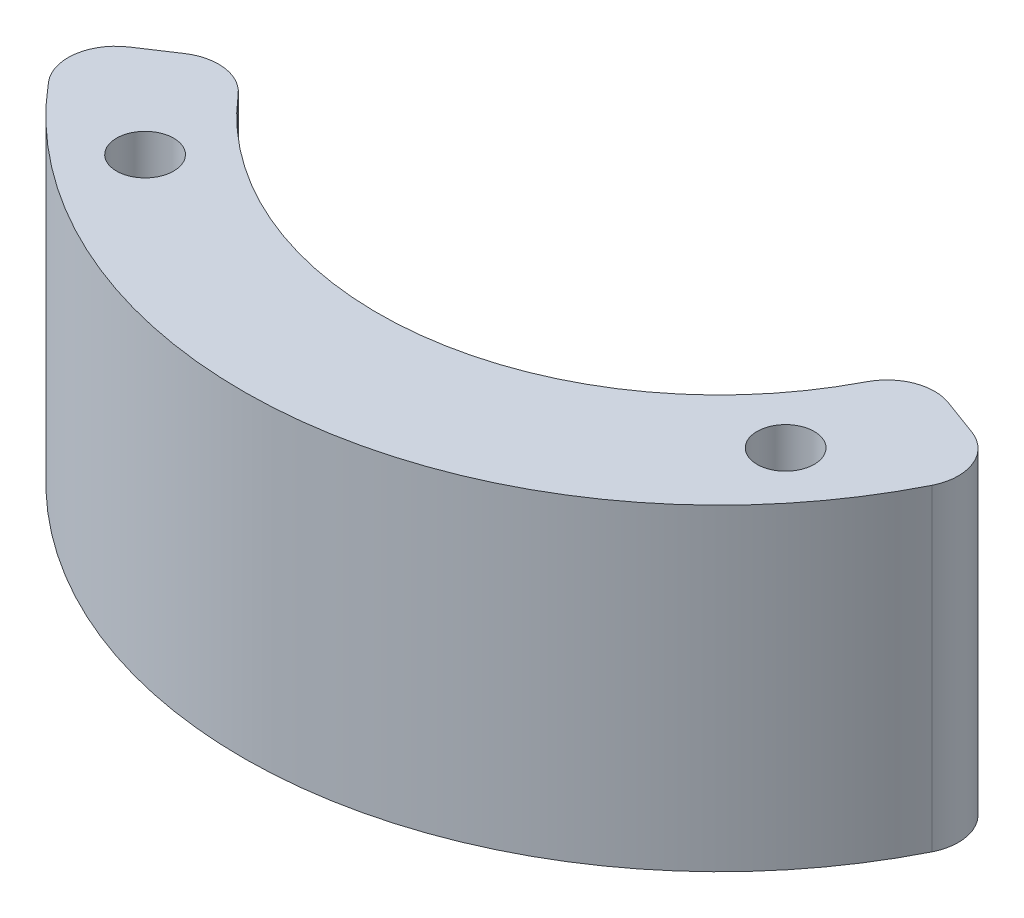
ISO-10303-21;
HEADER;
FILE_DESCRIPTION(('STEP AP214'),'2;1');
FILE_NAME('part.step','',(''),(''),'','','');
FILE_SCHEMA(('AUTOMOTIVE_DESIGN { 1 0 10303 214 1 1 1 1 }'));
ENDSEC;
DATA;
#1=APPLICATION_CONTEXT('core data for automotive mechanical design processes');
#2=APPLICATION_PROTOCOL_DEFINITION('international standard','automotive_design',2000,#1);
#3=PRODUCT_CONTEXT('',#1,'mechanical');
#4=PRODUCT('Part','Part','',(#3));
#5=PRODUCT_RELATED_PRODUCT_CATEGORY('part','',(#4));
#6=PRODUCT_DEFINITION_FORMATION('','',#4);
#7=PRODUCT_DEFINITION_CONTEXT('part definition',#1,'design');
#8=PRODUCT_DEFINITION('design','',#6,#7);
#9=PRODUCT_DEFINITION_SHAPE('','',#8);
#10=(LENGTH_UNIT() NAMED_UNIT(*) SI_UNIT(.MILLI.,.METRE.));
#11=(NAMED_UNIT(*) PLANE_ANGLE_UNIT() SI_UNIT($,.RADIAN.));
#12=(NAMED_UNIT(*) SI_UNIT($,.STERADIAN.) SOLID_ANGLE_UNIT());
#13=UNCERTAINTY_MEASURE_WITH_UNIT(LENGTH_MEASURE(1.E-05),#10,'distance_accuracy_value','');
#14=(GEOMETRIC_REPRESENTATION_CONTEXT(3) GLOBAL_UNCERTAINTY_ASSIGNED_CONTEXT((#13)) GLOBAL_UNIT_ASSIGNED_CONTEXT((#10,
#11,#12)) REPRESENTATION_CONTEXT('',''));
#15=CARTESIAN_POINT('',(0.,0.,0.));
#16=DIRECTION('',(0.,0.,1.));
#17=DIRECTION('',(1.,0.,0.));
#18=AXIS2_PLACEMENT_3D('',#15,#16,#17);
#19=CARTESIAN_POINT('',(0.,20.,0.));
#20=DIRECTION('',(0.,1.,0.));
#21=DIRECTION('',(0.,0.,1.));
#22=AXIS2_PLACEMENT_3D('',#19,#20,#21);
#23=PLANE('',#22);
#24=CARTESIAN_POINT('',(20.1757899473601,20.,16.0000000000001));
#25=DIRECTION('',(0.,1.,0.));
#26=DIRECTION('',(0.,0.,1.));
#27=AXIS2_PLACEMENT_3D('',#24,#25,#26);
#28=CIRCLE('',#27,1.8);
#29=CARTESIAN_POINT('',(20.1757899473601,20.,17.8000000000001));
#30=VERTEX_POINT('',#29);
#31=EDGE_CURVE('E148',#30,#30,#28,.T.);
#32=ORIENTED_EDGE('',*,*,#31,.F.);
#33=EDGE_LOOP('',(#32));
#34=FACE_BOUND('',#33,.T.);
#35=CARTESIAN_POINT('',(0.,20.,0.));
#36=DIRECTION('',(0.,1.,0.));
#37=DIRECTION('',(0.,0.,1.));
#38=AXIS2_PLACEMENT_3D('',#35,#36,#37);
#39=CIRCLE('',#38,30.);
#40=CARTESIAN_POINT('',(-23.023496221672,20.,19.2332686179613));
#41=VERTEX_POINT('',#40);
#42=CARTESIAN_POINT('',(26.8261895052967,20.,13.4296521409122));
#43=VERTEX_POINT('',#42);
#44=EDGE_CURVE('E154',#41,#43,#39,.T.);
#45=ORIENTED_EDGE('',*,*,#44,.T.);
#46=CARTESIAN_POINT('',(24.1435705547671,20.,12.086686926821));
#47=DIRECTION('',(0.,1.,0.));
#48=DIRECTION('',(0.,0.,1.));
#49=AXIS2_PLACEMENT_3D('',#46,#47,#48);
#50=CIRCLE('',#49,3.);
#51=CARTESIAN_POINT('',(25.1801513425418,20.,9.27146042253817));
#52=VERTEX_POINT('',#51);
#53=EDGE_CURVE('E178',#43,#52,#50,.T.);
#54=ORIENTED_EDGE('',*,*,#53,.T.);
#55=DIRECTION('',(-0.938408834760933,0.,-0.345526929258238));
#56=VECTOR('',#55,1.);
#57=CARTESIAN_POINT('',(20.1757899473601,20.,7.42882897905212));
#58=LINE('',#57,#56);
#59=CARTESIAN_POINT('',(22.8180046719536,20.,8.40170594526513));
#60=VERTEX_POINT('',#59);
#61=EDGE_CURVE('E131',#52,#60,#58,.T.);
#62=ORIENTED_EDGE('',*,*,#61,.T.);
#63=CARTESIAN_POINT('',(21.7814238841789,20.,11.2169324495479));
#64=DIRECTION('',(0.,1.,0.));
#65=DIRECTION('',(0.,0.,1.));
#66=AXIS2_PLACEMENT_3D('',#63,#64,#65);
#67=CIRCLE('',#66,3.);
#68=CARTESIAN_POINT('',(19.1143107555039,20.,9.84343051695022));
#69=VERTEX_POINT('',#68);
#70=EDGE_CURVE('E175',#60,#69,#67,.T.);
#71=ORIENTED_EDGE('',*,*,#70,.T.);
#72=CARTESIAN_POINT('',(0.,20.,0.));
#73=DIRECTION('',(0.,-1.,0.));
#74=DIRECTION('',(0.,0.,1.));
#75=AXIS2_PLACEMENT_3D('',#72,#73,#74);
#76=CIRCLE('',#75,21.5);
#77=CARTESIAN_POINT('',(-16.3417435760468,20.,13.9713069143417));
#78=VERTEX_POINT('',#77);
#79=EDGE_CURVE('E190',#69,#78,#76,.T.);
#80=ORIENTED_EDGE('',*,*,#79,.T.);
#81=CARTESIAN_POINT('',(-18.6219868657278,20.,15.9207916000638));
#82=DIRECTION('',(0.,1.,0.));
#83=DIRECTION('',(0.,0.,1.));
#84=AXIS2_PLACEMENT_3D('',#81,#82,#83);
#85=CIRCLE('',#84,3.);
#86=CARTESIAN_POINT('',(-20.277587843677,20.,13.4189951651368));
#87=VERTEX_POINT('',#86);
#88=EDGE_CURVE('E65',#78,#87,#85,.T.);
#89=ORIENTED_EDGE('',*,*,#88,.T.);
#90=DIRECTION('',(-0.833932144975681,0.,0.551866992649732));
#91=VECTOR('',#90,1.);
#92=CARTESIAN_POINT('',(-25.0179643492704,20.,16.556009779492));
#93=LINE('',#92,#91);
#94=CARTESIAN_POINT('',(-22.376747577454,20.,14.8081453212381));
#95=VERTEX_POINT('',#94);
#96=EDGE_CURVE('E156',#87,#95,#93,.T.);
#97=ORIENTED_EDGE('',*,*,#96,.T.);
#98=CARTESIAN_POINT('',(-20.7211465995048,20.,17.3099417561652));
#99=DIRECTION('',(0.,1.,0.));
#100=DIRECTION('',(0.,0.,1.));
#101=AXIS2_PLACEMENT_3D('',#98,#99,#100);
#102=CIRCLE('',#101,3.);
#103=EDGE_CURVE('E170',#95,#41,#102,.T.);
#104=ORIENTED_EDGE('',*,*,#103,.T.);
#105=EDGE_LOOP('',(#45,#54,#62,#71,#80,#89,#97,#104));
#106=FACE_BOUND('',#105,.T.);
#107=CARTESIAN_POINT('',(-16.0000000000002,20.,20.17578994736));
#108=DIRECTION('',(0.,1.,0.));
#109=DIRECTION('',(0.,0.,1.));
#110=AXIS2_PLACEMENT_3D('',#107,#108,#109);
#111=CIRCLE('',#110,1.8);
#112=CARTESIAN_POINT('',(-16.0000000000002,20.,21.97578994736));
#113=VERTEX_POINT('',#112);
#114=EDGE_CURVE('E203',#113,#113,#111,.T.);
#115=ORIENTED_EDGE('',*,*,#114,.F.);
#116=EDGE_LOOP('',(#115));
#117=FACE_BOUND('',#116,.T.);
#118=ADVANCED_FACE('F43',(#34,#106,#117),#23,.T.);
#119=CARTESIAN_POINT('',(0.,0.,0.));
#120=DIRECTION('',(0.,1.,0.));
#121=DIRECTION('',(0.,0.,1.));
#122=AXIS2_PLACEMENT_3D('',#119,#120,#121);
#123=PLANE('',#122);
#124=DIRECTION('',(-0.938408834760933,0.,-0.345526929258238));
#125=VECTOR('',#124,1.);
#126=CARTESIAN_POINT('',(20.1757899473601,0.,7.42882897905212));
#127=LINE('',#126,#125);
#128=CARTESIAN_POINT('',(25.1801513425418,0.,9.27146042253817));
#129=VERTEX_POINT('',#128);
#130=CARTESIAN_POINT('',(22.8180046719536,0.,8.40170594526513));
#131=VERTEX_POINT('',#130);
#132=EDGE_CURVE('E128',#129,#131,#127,.T.);
#133=ORIENTED_EDGE('',*,*,#132,.F.);
#134=CARTESIAN_POINT('',(24.1435705547671,0.,12.086686926821));
#135=DIRECTION('',(0.,1.,0.));
#136=DIRECTION('',(0.,0.,1.));
#137=AXIS2_PLACEMENT_3D('',#134,#135,#136);
#138=CIRCLE('',#137,3.);
#139=CARTESIAN_POINT('',(26.8261895052967,0.,13.4296521409122));
#140=VERTEX_POINT('',#139);
#141=EDGE_CURVE('E110',#129,#140,#138,.F.);
#142=ORIENTED_EDGE('',*,*,#141,.T.);
#143=CARTESIAN_POINT('',(0.,0.,0.));
#144=DIRECTION('',(0.,1.,0.));
#145=DIRECTION('',(0.,0.,1.));
#146=AXIS2_PLACEMENT_3D('',#143,#144,#145);
#147=CIRCLE('',#146,30.);
#148=CARTESIAN_POINT('',(-23.023496221672,0.,19.2332686179613));
#149=VERTEX_POINT('',#148);
#150=EDGE_CURVE('E141',#149,#140,#147,.T.);
#151=ORIENTED_EDGE('',*,*,#150,.F.);
#152=CARTESIAN_POINT('',(-20.7211465995048,0.,17.3099417561652));
#153=DIRECTION('',(0.,1.,0.));
#154=DIRECTION('',(0.,0.,1.));
#155=AXIS2_PLACEMENT_3D('',#152,#153,#154);
#156=CIRCLE('',#155,3.);
#157=CARTESIAN_POINT('',(-22.376747577454,0.,14.8081453212381));
#158=VERTEX_POINT('',#157);
#159=EDGE_CURVE('E133',#149,#158,#156,.F.);
#160=ORIENTED_EDGE('',*,*,#159,.T.);
#161=DIRECTION('',(-0.833932144975681,0.,0.551866992649732));
#162=VECTOR('',#161,1.);
#163=CARTESIAN_POINT('',(-25.0179643492704,0.,16.556009779492));
#164=LINE('',#163,#162);
#165=CARTESIAN_POINT('',(-20.277587843677,0.,13.4189951651368));
#166=VERTEX_POINT('',#165);
#167=EDGE_CURVE('E146',#166,#158,#164,.T.);
#168=ORIENTED_EDGE('',*,*,#167,.F.);
#169=CARTESIAN_POINT('',(-18.6219868657278,0.,15.9207916000638));
#170=DIRECTION('',(0.,1.,0.));
#171=DIRECTION('',(0.,0.,1.));
#172=AXIS2_PLACEMENT_3D('',#169,#170,#171);
#173=CIRCLE('',#172,3.);
#174=CARTESIAN_POINT('',(-16.3417435760468,0.,13.9713069143417));
#175=VERTEX_POINT('',#174);
#176=EDGE_CURVE('E160',#166,#175,#173,.F.);
#177=ORIENTED_EDGE('',*,*,#176,.T.);
#178=CARTESIAN_POINT('',(0.,0.,0.));
#179=DIRECTION('',(0.,-1.,0.));
#180=DIRECTION('',(0.,0.,1.));
#181=AXIS2_PLACEMENT_3D('',#178,#179,#180);
#182=CIRCLE('',#181,21.5);
#183=CARTESIAN_POINT('',(19.1143107555039,0.,9.84343051695022));
#184=VERTEX_POINT('',#183);
#185=EDGE_CURVE('E140',#184,#175,#182,.T.);
#186=ORIENTED_EDGE('',*,*,#185,.F.);
#187=CARTESIAN_POINT('',(21.7814238841789,0.,11.2169324495479));
#188=DIRECTION('',(0.,1.,0.));
#189=DIRECTION('',(0.,0.,1.));
#190=AXIS2_PLACEMENT_3D('',#187,#188,#189);
#191=CIRCLE('',#190,3.);
#192=EDGE_CURVE('E122',#184,#131,#191,.F.);
#193=ORIENTED_EDGE('',*,*,#192,.T.);
#194=EDGE_LOOP('',(#133,#142,#151,#160,#168,#177,#186,#193));
#195=FACE_BOUND('',#194,.T.);
#196=CARTESIAN_POINT('',(20.1757899473601,0.,16.0000000000001));
#197=DIRECTION('',(0.,1.,0.));
#198=DIRECTION('',(0.,0.,1.));
#199=AXIS2_PLACEMENT_3D('',#196,#197,#198);
#200=CIRCLE('',#199,1.8);
#201=CARTESIAN_POINT('',(20.1757899473601,0.,17.8000000000001));
#202=VERTEX_POINT('',#201);
#203=EDGE_CURVE('E199',#202,#202,#200,.T.);
#204=ORIENTED_EDGE('',*,*,#203,.T.);
#205=EDGE_LOOP('',(#204));
#206=FACE_BOUND('',#205,.T.);
#207=CARTESIAN_POINT('',(-16.0000000000002,0.,20.17578994736));
#208=DIRECTION('',(0.,1.,0.));
#209=DIRECTION('',(0.,0.,1.));
#210=AXIS2_PLACEMENT_3D('',#207,#208,#209);
#211=CIRCLE('',#210,1.8);
#212=CARTESIAN_POINT('',(-16.0000000000002,0.,21.97578994736));
#213=VERTEX_POINT('',#212);
#214=EDGE_CURVE('E207',#213,#213,#211,.T.);
#215=ORIENTED_EDGE('',*,*,#214,.T.);
#216=EDGE_LOOP('',(#215));
#217=FACE_BOUND('',#216,.T.);
#218=ADVANCED_FACE('F136',(#195,#206,#217),#123,.F.);
#219=CARTESIAN_POINT('',(0.,20.,0.));
#220=DIRECTION('',(0.,-1.,0.));
#221=DIRECTION('',(0.,0.,-1.));
#222=AXIS2_PLACEMENT_3D('',#219,#220,#221);
#223=CYLINDRICAL_SURFACE('',#222,30.);
#224=ORIENTED_EDGE('',*,*,#150,.T.);
#225=DIRECTION('',(0.,-1.,0.));
#226=VECTOR('',#225,1.);
#227=CARTESIAN_POINT('',(26.8261895052967,20.,13.4296521409122));
#228=LINE('',#227,#226);
#229=EDGE_CURVE('E115',#140,#43,#228,.F.);
#230=ORIENTED_EDGE('',*,*,#229,.T.);
#231=ORIENTED_EDGE('',*,*,#44,.F.);
#232=DIRECTION('',(0.,-1.,0.));
#233=VECTOR('',#232,1.);
#234=CARTESIAN_POINT('',(-23.023496221672,20.,19.2332686179613));
#235=LINE('',#234,#233);
#236=EDGE_CURVE('E121',#41,#149,#235,.T.);
#237=ORIENTED_EDGE('',*,*,#236,.T.);
#238=EDGE_LOOP('',(#224,#230,#231,#237));
#239=FACE_BOUND('',#238,.T.);
#240=ADVANCED_FACE('F225',(#239),#223,.T.);
#241=CARTESIAN_POINT('',(20.1757899473601,20.,7.42882897905212));
#242=DIRECTION('',(-0.345526929258238,0.,0.938408834760933));
#243=DIRECTION('',(0.938408834760933,0.,0.345526929258238));
#244=AXIS2_PLACEMENT_3D('',#241,#242,#243);
#245=PLANE('',#244);
#246=ORIENTED_EDGE('',*,*,#61,.F.);
#247=DIRECTION('',(0.,-1.,0.));
#248=VECTOR('',#247,1.);
#249=CARTESIAN_POINT('',(25.1801513425418,20.,9.27146042253817));
#250=LINE('',#249,#248);
#251=EDGE_CURVE('E114',#52,#129,#250,.T.);
#252=ORIENTED_EDGE('',*,*,#251,.T.);
#253=ORIENTED_EDGE('',*,*,#132,.T.);
#254=DIRECTION('',(0.,-1.,0.));
#255=VECTOR('',#254,1.);
#256=CARTESIAN_POINT('',(22.8180046719536,20.,8.40170594526513));
#257=LINE('',#256,#255);
#258=EDGE_CURVE('E134',#131,#60,#257,.F.);
#259=ORIENTED_EDGE('',*,*,#258,.T.);
#260=EDGE_LOOP('',(#246,#252,#253,#259));
#261=FACE_BOUND('',#260,.T.);
#262=ADVANCED_FACE('F127',(#261),#245,.F.);
#263=CARTESIAN_POINT('',(0.,20.,0.));
#264=DIRECTION('',(0.,-1.,0.));
#265=DIRECTION('',(0.,0.,-1.));
#266=AXIS2_PLACEMENT_3D('',#263,#264,#265);
#267=CYLINDRICAL_SURFACE('',#266,21.5);
#268=ORIENTED_EDGE('',*,*,#79,.F.);
#269=DIRECTION('',(0.,-1.,0.));
#270=VECTOR('',#269,1.);
#271=CARTESIAN_POINT('',(19.1143107555039,20.,9.84343051695022));
#272=LINE('',#271,#270);
#273=EDGE_CURVE('E184',#69,#184,#272,.T.);
#274=ORIENTED_EDGE('',*,*,#273,.T.);
#275=ORIENTED_EDGE('',*,*,#185,.T.);
#276=DIRECTION('',(0.,-1.,0.));
#277=VECTOR('',#276,1.);
#278=CARTESIAN_POINT('',(-16.3417435760468,20.,13.9713069143417));
#279=LINE('',#278,#277);
#280=EDGE_CURVE('E181',#175,#78,#279,.F.);
#281=ORIENTED_EDGE('',*,*,#280,.T.);
#282=EDGE_LOOP('',(#268,#274,#275,#281));
#283=FACE_BOUND('',#282,.T.);
#284=ADVANCED_FACE('F235',(#283),#267,.F.);
#285=CARTESIAN_POINT('',(-25.0179643492704,20.,16.556009779492));
#286=DIRECTION('',(0.551866992649732,0.,0.833932144975681));
#287=DIRECTION('',(0.833932144975681,0.,-0.551866992649732));
#288=AXIS2_PLACEMENT_3D('',#285,#286,#287);
#289=PLANE('',#288);
#290=ORIENTED_EDGE('',*,*,#96,.F.);
#291=DIRECTION('',(0.,-1.,0.));
#292=VECTOR('',#291,1.);
#293=CARTESIAN_POINT('',(-20.277587843677,20.,13.4189951651368));
#294=LINE('',#293,#292);
#295=EDGE_CURVE('E11',#87,#166,#294,.T.);
#296=ORIENTED_EDGE('',*,*,#295,.T.);
#297=ORIENTED_EDGE('',*,*,#167,.T.);
#298=DIRECTION('',(0.,-1.,0.));
#299=VECTOR('',#298,1.);
#300=CARTESIAN_POINT('',(-22.376747577454,20.,14.8081453212381));
#301=LINE('',#300,#299);
#302=EDGE_CURVE('E52',#158,#95,#301,.F.);
#303=ORIENTED_EDGE('',*,*,#302,.T.);
#304=EDGE_LOOP('',(#290,#296,#297,#303));
#305=FACE_BOUND('',#304,.T.);
#306=ADVANCED_FACE('F232',(#305),#289,.F.);
#307=CARTESIAN_POINT('',(20.1757899473601,20.,16.0000000000001));
#308=DIRECTION('',(0.,-1.,0.));
#309=DIRECTION('',(0.,0.,-1.));
#310=AXIS2_PLACEMENT_3D('',#307,#308,#309);
#311=CYLINDRICAL_SURFACE('',#310,1.8);
#312=ORIENTED_EDGE('',*,*,#31,.T.);
#313=EDGE_LOOP('',(#312));
#314=FACE_BOUND('',#313,.T.);
#315=ORIENTED_EDGE('',*,*,#203,.F.);
#316=EDGE_LOOP('',(#315));
#317=FACE_BOUND('',#316,.T.);
#318=ADVANCED_FACE('F229',(#314,#317),#311,.F.);
#319=CARTESIAN_POINT('',(-16.0000000000002,20.,20.17578994736));
#320=DIRECTION('',(0.,-1.,0.));
#321=DIRECTION('',(0.,0.,-1.));
#322=AXIS2_PLACEMENT_3D('',#319,#320,#321);
#323=CYLINDRICAL_SURFACE('',#322,1.8);
#324=ORIENTED_EDGE('',*,*,#114,.T.);
#325=EDGE_LOOP('',(#324));
#326=FACE_BOUND('',#325,.T.);
#327=ORIENTED_EDGE('',*,*,#214,.F.);
#328=EDGE_LOOP('',(#327));
#329=FACE_BOUND('',#328,.T.);
#330=ADVANCED_FACE('F215',(#326,#329),#323,.F.);
#331=CARTESIAN_POINT('',(24.1435705547671,20.,12.086686926821));
#332=DIRECTION('',(0.,-1.,0.));
#333=DIRECTION('',(0.,0.,-1.));
#334=AXIS2_PLACEMENT_3D('',#331,#332,#333);
#335=CYLINDRICAL_SURFACE('',#334,3.);
#336=ORIENTED_EDGE('',*,*,#53,.F.);
#337=ORIENTED_EDGE('',*,*,#229,.F.);
#338=ORIENTED_EDGE('',*,*,#141,.F.);
#339=ORIENTED_EDGE('',*,*,#251,.F.);
#340=EDGE_LOOP('',(#336,#337,#338,#339));
#341=FACE_BOUND('',#340,.T.);
#342=ADVANCED_FACE('F113',(#341),#335,.T.);
#343=CARTESIAN_POINT('',(21.7814238841789,20.,11.2169324495479));
#344=DIRECTION('',(0.,-1.,0.));
#345=DIRECTION('',(0.,0.,-1.));
#346=AXIS2_PLACEMENT_3D('',#343,#344,#345);
#347=CYLINDRICAL_SURFACE('',#346,3.);
#348=ORIENTED_EDGE('',*,*,#70,.F.);
#349=ORIENTED_EDGE('',*,*,#258,.F.);
#350=ORIENTED_EDGE('',*,*,#192,.F.);
#351=ORIENTED_EDGE('',*,*,#273,.F.);
#352=EDGE_LOOP('',(#348,#349,#350,#351));
#353=FACE_BOUND('',#352,.T.);
#354=ADVANCED_FACE('F246',(#353),#347,.T.);
#355=CARTESIAN_POINT('',(-18.6219868657278,20.,15.9207916000638));
#356=DIRECTION('',(0.,-1.,0.));
#357=DIRECTION('',(0.,0.,-1.));
#358=AXIS2_PLACEMENT_3D('',#355,#356,#357);
#359=CYLINDRICAL_SURFACE('',#358,3.);
#360=ORIENTED_EDGE('',*,*,#88,.F.);
#361=ORIENTED_EDGE('',*,*,#280,.F.);
#362=ORIENTED_EDGE('',*,*,#176,.F.);
#363=ORIENTED_EDGE('',*,*,#295,.F.);
#364=EDGE_LOOP('',(#360,#361,#362,#363));
#365=FACE_BOUND('',#364,.T.);
#366=ADVANCED_FACE('F248',(#365),#359,.T.);
#367=CARTESIAN_POINT('',(-20.7211465995048,20.,17.3099417561652));
#368=DIRECTION('',(0.,-1.,0.));
#369=DIRECTION('',(0.,0.,-1.));
#370=AXIS2_PLACEMENT_3D('',#367,#368,#369);
#371=CYLINDRICAL_SURFACE('',#370,3.);
#372=ORIENTED_EDGE('',*,*,#103,.F.);
#373=ORIENTED_EDGE('',*,*,#302,.F.);
#374=ORIENTED_EDGE('',*,*,#159,.F.);
#375=ORIENTED_EDGE('',*,*,#236,.F.);
#376=EDGE_LOOP('',(#372,#373,#374,#375));
#377=FACE_BOUND('',#376,.T.);
#378=ADVANCED_FACE('F45',(#377),#371,.T.);
#379=CLOSED_SHELL('',(#118,#218,#240,#262,#284,#306,#318,#330,#342,#354,#366,#378));
#380=MANIFOLD_SOLID_BREP('B2',#379);
#381=ADVANCED_BREP_SHAPE_REPRESENTATION('',(#18,#380),#14);
#382=SHAPE_DEFINITION_REPRESENTATION(#9,#381);
ENDSEC;
END-ISO-10303-21;
